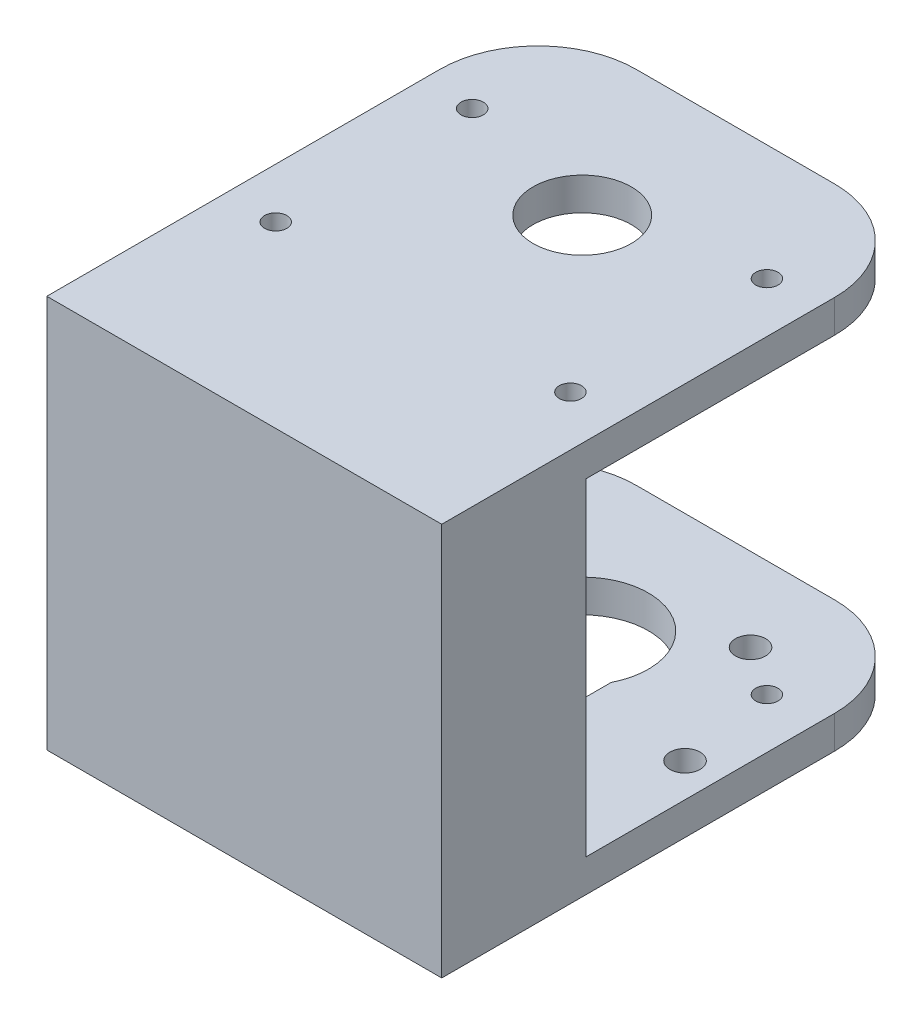
ISO-10303-21;
HEADER;
FILE_DESCRIPTION(('STEP AP214'),'2;1');
FILE_NAME('part.step','',(''),(''),'','','');
FILE_SCHEMA(('AUTOMOTIVE_DESIGN { 1 0 10303 214 1 1 1 1 }'));
ENDSEC;
DATA;
#1=APPLICATION_CONTEXT('core data for automotive mechanical design processes');
#2=APPLICATION_PROTOCOL_DEFINITION('international standard','automotive_design',2000,#1);
#3=PRODUCT_CONTEXT('',#1,'mechanical');
#4=PRODUCT('Part','Part','',(#3));
#5=PRODUCT_RELATED_PRODUCT_CATEGORY('part','',(#4));
#6=PRODUCT_DEFINITION_FORMATION('','',#4);
#7=PRODUCT_DEFINITION_CONTEXT('part definition',#1,'design');
#8=PRODUCT_DEFINITION('design','',#6,#7);
#9=PRODUCT_DEFINITION_SHAPE('','',#8);
#10=(LENGTH_UNIT() NAMED_UNIT(*) SI_UNIT(.MILLI.,.METRE.));
#11=(NAMED_UNIT(*) PLANE_ANGLE_UNIT() SI_UNIT($,.RADIAN.));
#12=(NAMED_UNIT(*) SI_UNIT($,.STERADIAN.) SOLID_ANGLE_UNIT());
#13=UNCERTAINTY_MEASURE_WITH_UNIT(LENGTH_MEASURE(1.E-05),#10,'distance_accuracy_value','');
#14=(GEOMETRIC_REPRESENTATION_CONTEXT(3) GLOBAL_UNCERTAINTY_ASSIGNED_CONTEXT((#13)) GLOBAL_UNIT_ASSIGNED_CONTEXT((#10,
#11,#12)) REPRESENTATION_CONTEXT('',''));
#15=CARTESIAN_POINT('',(0.,0.,0.));
#16=DIRECTION('',(0.,0.,1.));
#17=DIRECTION('',(1.,0.,0.));
#18=AXIS2_PLACEMENT_3D('',#15,#16,#17);
#19=CARTESIAN_POINT('',(15.15,5.,17.7));
#20=DIRECTION('',(0.,1.,0.));
#21=DIRECTION('',(0.,0.,1.));
#22=AXIS2_PLACEMENT_3D('',#19,#20,#21);
#23=PLANE('',#22);
#24=DIRECTION('',(-1.,0.,0.));
#25=VECTOR('',#24,1.);
#26=CARTESIAN_POINT('',(30.15,5.,20.3));
#27=LINE('',#26,#25);
#28=CARTESIAN_POINT('',(30.15,5.,20.3));
#29=VERTEX_POINT('',#28);
#30=CARTESIAN_POINT('',(17.2803508501983,5.,20.3));
#31=VERTEX_POINT('',#30);
#32=EDGE_CURVE('E51',#29,#31,#27,.T.);
#33=ORIENTED_EDGE('',*,*,#32,.F.);
#34=DIRECTION('',(0.,0.,-1.));
#35=VECTOR('',#34,1.);
#36=CARTESIAN_POINT('',(30.15,5.,17.7));
#37=LINE('',#36,#35);
#38=CARTESIAN_POINT('',(30.15,5.,-17.7));
#39=VERTEX_POINT('',#38);
#40=EDGE_CURVE('E184',#29,#39,#37,.T.);
#41=ORIENTED_EDGE('',*,*,#40,.T.);
#42=CARTESIAN_POINT('',(15.15,5.,-17.7));
#43=DIRECTION('',(0.,1.,0.));
#44=DIRECTION('',(0.,0.,1.));
#45=AXIS2_PLACEMENT_3D('',#42,#43,#44);
#46=CIRCLE('',#45,15.);
#47=CARTESIAN_POINT('',(15.15,5.,-32.7));
#48=VERTEX_POINT('',#47);
#49=EDGE_CURVE('E357',#39,#48,#46,.T.);
#50=ORIENTED_EDGE('',*,*,#49,.T.);
#51=DIRECTION('',(-1.,0.,0.));
#52=VECTOR('',#51,1.);
#53=CARTESIAN_POINT('',(15.15,5.,-32.7));
#54=LINE('',#53,#52);
#55=CARTESIAN_POINT('',(-15.15,5.,-32.7));
#56=VERTEX_POINT('',#55);
#57=EDGE_CURVE('E360',#48,#56,#54,.T.);
#58=ORIENTED_EDGE('',*,*,#57,.T.);
#59=CARTESIAN_POINT('',(-15.15,5.,-17.7));
#60=DIRECTION('',(0.,1.,0.));
#61=DIRECTION('',(0.,0.,1.));
#62=AXIS2_PLACEMENT_3D('',#59,#60,#61);
#63=CIRCLE('',#62,15.);
#64=CARTESIAN_POINT('',(-30.15,5.,-17.7));
#65=VERTEX_POINT('',#64);
#66=EDGE_CURVE('E362',#56,#65,#63,.T.);
#67=ORIENTED_EDGE('',*,*,#66,.T.);
#68=DIRECTION('',(0.,0.,1.));
#69=VECTOR('',#68,1.);
#70=CARTESIAN_POINT('',(-30.15,5.,17.7));
#71=LINE('',#70,#69);
#72=CARTESIAN_POINT('',(-30.15,5.,20.3));
#73=VERTEX_POINT('',#72);
#74=EDGE_CURVE('E58',#65,#73,#71,.T.);
#75=ORIENTED_EDGE('',*,*,#74,.T.);
#76=CARTESIAN_POINT('',(-17.2803508501983,5.,20.3));
#77=VERTEX_POINT('',#76);
#78=EDGE_CURVE('E185',#77,#73,#27,.T.);
#79=ORIENTED_EDGE('',*,*,#78,.F.);
#80=CARTESIAN_POINT('',(-15.,5.,20.));
#81=DIRECTION('',(0.,1.,0.));
#82=DIRECTION('',(0.,0.,1.));
#83=AXIS2_PLACEMENT_3D('',#80,#81,#82);
#84=CIRCLE('',#83,2.30000000000001);
#85=CARTESIAN_POINT('',(-12.7196491498017,5.,20.3));
#86=VERTEX_POINT('',#85);
#87=EDGE_CURVE('E338',#86,#77,#84,.T.);
#88=ORIENTED_EDGE('',*,*,#87,.F.);
#89=CARTESIAN_POINT('',(12.7196491498017,5.,20.3));
#90=VERTEX_POINT('',#89);
#91=EDGE_CURVE('E776',#90,#86,#27,.T.);
#92=ORIENTED_EDGE('',*,*,#91,.F.);
#93=CARTESIAN_POINT('',(15.,5.,20.));
#94=DIRECTION('',(0.,1.,0.));
#95=DIRECTION('',(0.,0.,-1.));
#96=AXIS2_PLACEMENT_3D('',#93,#94,#95);
#97=CIRCLE('',#96,2.30000000000001);
#98=EDGE_CURVE('E268',#31,#90,#97,.T.);
#99=ORIENTED_EDGE('',*,*,#98,.F.);
#100=EDGE_LOOP('',(#33,#41,#50,#58,#67,#75,#79,#88,#92,#99));
#101=FACE_BOUND('',#100,.T.);
#102=CARTESIAN_POINT('',(22.5,5.,15.));
#103=DIRECTION('',(0.,1.,0.));
#104=DIRECTION('',(0.,0.,-1.));
#105=AXIS2_PLACEMENT_3D('',#102,#103,#104);
#106=CIRCLE('',#105,1.70000000000001);
#107=CARTESIAN_POINT('',(22.5,5.,13.3));
#108=VERTEX_POINT('',#107);
#109=EDGE_CURVE('E271',#108,#108,#106,.T.);
#110=ORIENTED_EDGE('',*,*,#109,.F.);
#111=EDGE_LOOP('',(#110));
#112=FACE_BOUND('',#111,.T.);
#113=CARTESIAN_POINT('',(22.5,5.,-15.));
#114=DIRECTION('',(0.,1.,0.));
#115=DIRECTION('',(0.,0.,-1.));
#116=AXIS2_PLACEMENT_3D('',#113,#114,#115);
#117=CIRCLE('',#116,1.70000000000001);
#118=CARTESIAN_POINT('',(22.5,5.,-16.7));
#119=VERTEX_POINT('',#118);
#120=EDGE_CURVE('E283',#119,#119,#117,.T.);
#121=ORIENTED_EDGE('',*,*,#120,.F.);
#122=EDGE_LOOP('',(#121));
#123=FACE_BOUND('',#122,.T.);
#124=CARTESIAN_POINT('',(0.,5.,-9.29999999999999));
#125=DIRECTION('',(0.,1.,0.));
#126=DIRECTION('',(0.,0.,1.));
#127=AXIS2_PLACEMENT_3D('',#124,#125,#126);
#128=CIRCLE('',#127,10.1);
#129=CARTESIAN_POINT('',(8.99999999999999,5.,-4.71633334545364));
#130=VERTEX_POINT('',#129);
#131=CARTESIAN_POINT('',(-8.99999999999999,5.,-4.71633334545364));
#132=VERTEX_POINT('',#131);
#133=EDGE_CURVE('E297',#130,#132,#128,.T.);
#134=ORIENTED_EDGE('',*,*,#133,.F.);
#135=DIRECTION('',(0.,0.,-1.));
#136=VECTOR('',#135,1.);
#137=CARTESIAN_POINT('',(8.99999999999999,5.,-4.71633334545364));
#138=LINE('',#137,#136);
#139=CARTESIAN_POINT('',(9.00000000000001,5.,16.9));
#140=VERTEX_POINT('',#139);
#141=EDGE_CURVE('E295',#140,#130,#138,.T.);
#142=ORIENTED_EDGE('',*,*,#141,.F.);
#143=DIRECTION('',(1.,0.,0.));
#144=VECTOR('',#143,1.);
#145=CARTESIAN_POINT('',(-8.99999999999999,5.,16.9));
#146=LINE('',#145,#144);
#147=CARTESIAN_POINT('',(-8.99999999999999,5.,16.9));
#148=VERTEX_POINT('',#147);
#149=EDGE_CURVE('E303',#148,#140,#146,.T.);
#150=ORIENTED_EDGE('',*,*,#149,.F.);
#151=DIRECTION('',(0.,0.,1.));
#152=VECTOR('',#151,1.);
#153=CARTESIAN_POINT('',(-8.99999999999999,5.,-4.71633334545364));
#154=LINE('',#153,#152);
#155=EDGE_CURVE('E300',#132,#148,#154,.T.);
#156=ORIENTED_EDGE('',*,*,#155,.F.);
#157=EDGE_LOOP('',(#134,#142,#150,#156));
#158=FACE_BOUND('',#157,.T.);
#159=CARTESIAN_POINT('',(-22.5,5.,-15.));
#160=DIRECTION('',(0.,1.,0.));
#161=DIRECTION('',(0.,0.,1.));
#162=AXIS2_PLACEMENT_3D('',#159,#160,#161);
#163=CIRCLE('',#162,1.70000000000001);
#164=CARTESIAN_POINT('',(-22.5,5.,-13.3));
#165=VERTEX_POINT('',#164);
#166=EDGE_CURVE('E326',#165,#165,#163,.T.);
#167=ORIENTED_EDGE('',*,*,#166,.F.);
#168=EDGE_LOOP('',(#167));
#169=FACE_BOUND('',#168,.T.);
#170=CARTESIAN_POINT('',(-15.,5.,-20.));
#171=DIRECTION('',(0.,1.,0.));
#172=DIRECTION('',(0.,0.,1.));
#173=AXIS2_PLACEMENT_3D('',#170,#171,#172);
#174=CIRCLE('',#173,2.3);
#175=CARTESIAN_POINT('',(-15.,5.,-17.7));
#176=VERTEX_POINT('',#175);
#177=EDGE_CURVE('E350',#176,#176,#174,.T.);
#178=ORIENTED_EDGE('',*,*,#177,.F.);
#179=EDGE_LOOP('',(#178));
#180=FACE_BOUND('',#179,.T.);
#181=CARTESIAN_POINT('',(-25.,5.,0.));
#182=DIRECTION('',(0.,1.,0.));
#183=DIRECTION('',(0.,0.,1.));
#184=AXIS2_PLACEMENT_3D('',#181,#182,#183);
#185=CIRCLE('',#184,2.29999999999999);
#186=CARTESIAN_POINT('',(-25.,5.,2.29999999999999));
#187=VERTEX_POINT('',#186);
#188=EDGE_CURVE('E344',#187,#187,#185,.T.);
#189=ORIENTED_EDGE('',*,*,#188,.F.);
#190=EDGE_LOOP('',(#189));
#191=FACE_BOUND('',#190,.T.);
#192=CARTESIAN_POINT('',(-22.5,5.,15.));
#193=DIRECTION('',(0.,1.,0.));
#194=DIRECTION('',(0.,0.,1.));
#195=AXIS2_PLACEMENT_3D('',#192,#193,#194);
#196=CIRCLE('',#195,1.70000000000001);
#197=CARTESIAN_POINT('',(-22.5,5.,16.7));
#198=VERTEX_POINT('',#197);
#199=EDGE_CURVE('E332',#198,#198,#196,.T.);
#200=ORIENTED_EDGE('',*,*,#199,.F.);
#201=EDGE_LOOP('',(#200));
#202=FACE_BOUND('',#201,.T.);
#203=CARTESIAN_POINT('',(15.,5.,-20.));
#204=DIRECTION('',(0.,1.,0.));
#205=DIRECTION('',(0.,0.,-1.));
#206=AXIS2_PLACEMENT_3D('',#203,#204,#205);
#207=CIRCLE('',#206,2.3);
#208=CARTESIAN_POINT('',(15.,5.,-22.3));
#209=VERTEX_POINT('',#208);
#210=EDGE_CURVE('E289',#209,#209,#207,.T.);
#211=ORIENTED_EDGE('',*,*,#210,.F.);
#212=EDGE_LOOP('',(#211));
#213=FACE_BOUND('',#212,.T.);
#214=CARTESIAN_POINT('',(25.,5.,0.));
#215=DIRECTION('',(0.,1.,0.));
#216=DIRECTION('',(0.,0.,-1.));
#217=AXIS2_PLACEMENT_3D('',#214,#215,#216);
#218=CIRCLE('',#217,2.29999999999999);
#219=CARTESIAN_POINT('',(25.,5.,-2.29999999999999));
#220=VERTEX_POINT('',#219);
#221=EDGE_CURVE('E277',#220,#220,#218,.T.);
#222=ORIENTED_EDGE('',*,*,#221,.F.);
#223=EDGE_LOOP('',(#222));
#224=FACE_BOUND('',#223,.T.);
#225=ADVANCED_FACE('F36',(#101,#112,#123,#158,#169,#180,#191,#202,#213,#224),#23,.T.);
#226=CARTESIAN_POINT('',(15.15,0.,17.7));
#227=DIRECTION('',(0.,1.,0.));
#228=DIRECTION('',(0.,0.,1.));
#229=AXIS2_PLACEMENT_3D('',#226,#227,#228);
#230=PLANE('',#229);
#231=DIRECTION('',(-1.,0.,0.));
#232=VECTOR('',#231,1.);
#233=CARTESIAN_POINT('',(-30.15,0.,42.3));
#234=LINE('',#233,#232);
#235=CARTESIAN_POINT('',(30.15,0.,42.3));
#236=VERTEX_POINT('',#235);
#237=CARTESIAN_POINT('',(-30.15,0.,42.3));
#238=VERTEX_POINT('',#237);
#239=EDGE_CURVE('E254',#236,#238,#234,.T.);
#240=ORIENTED_EDGE('',*,*,#239,.T.);
#241=DIRECTION('',(0.,0.,1.));
#242=VECTOR('',#241,1.);
#243=CARTESIAN_POINT('',(-30.15,0.,17.7));
#244=LINE('',#243,#242);
#245=CARTESIAN_POINT('',(-30.15,0.,-17.7));
#246=VERTEX_POINT('',#245);
#247=EDGE_CURVE('E358',#246,#238,#244,.T.);
#248=ORIENTED_EDGE('',*,*,#247,.F.);
#249=CARTESIAN_POINT('',(-15.15,0.,-17.7));
#250=DIRECTION('',(0.,1.,0.));
#251=DIRECTION('',(0.,0.,1.));
#252=AXIS2_PLACEMENT_3D('',#249,#250,#251);
#253=CIRCLE('',#252,15.);
#254=CARTESIAN_POINT('',(-15.15,0.,-32.7));
#255=VERTEX_POINT('',#254);
#256=EDGE_CURVE('E371',#255,#246,#253,.T.);
#257=ORIENTED_EDGE('',*,*,#256,.F.);
#258=DIRECTION('',(-1.,0.,0.));
#259=VECTOR('',#258,1.);
#260=CARTESIAN_POINT('',(15.15,0.,-32.7));
#261=LINE('',#260,#259);
#262=CARTESIAN_POINT('',(15.15,0.,-32.7));
#263=VERTEX_POINT('',#262);
#264=EDGE_CURVE('E369',#263,#255,#261,.T.);
#265=ORIENTED_EDGE('',*,*,#264,.F.);
#266=CARTESIAN_POINT('',(15.15,0.,-17.7));
#267=DIRECTION('',(0.,1.,0.));
#268=DIRECTION('',(0.,0.,1.));
#269=AXIS2_PLACEMENT_3D('',#266,#267,#268);
#270=CIRCLE('',#269,15.);
#271=CARTESIAN_POINT('',(30.15,0.,-17.7));
#272=VERTEX_POINT('',#271);
#273=EDGE_CURVE('E367',#272,#263,#270,.T.);
#274=ORIENTED_EDGE('',*,*,#273,.F.);
#275=DIRECTION('',(0.,0.,-1.));
#276=VECTOR('',#275,1.);
#277=CARTESIAN_POINT('',(30.15,0.,17.7));
#278=LINE('',#277,#276);
#279=EDGE_CURVE('E353',#236,#272,#278,.T.);
#280=ORIENTED_EDGE('',*,*,#279,.F.);
#281=EDGE_LOOP('',(#240,#248,#257,#265,#274,#280));
#282=FACE_BOUND('',#281,.T.);
#283=CARTESIAN_POINT('',(-22.5,0.,-15.));
#284=DIRECTION('',(0.,1.,0.));
#285=DIRECTION('',(0.,0.,1.));
#286=AXIS2_PLACEMENT_3D('',#283,#284,#285);
#287=CIRCLE('',#286,1.70000000000001);
#288=CARTESIAN_POINT('',(-22.5,0.,-13.3));
#289=VERTEX_POINT('',#288);
#290=EDGE_CURVE('E325',#289,#289,#287,.T.);
#291=ORIENTED_EDGE('',*,*,#290,.T.);
#292=EDGE_LOOP('',(#291));
#293=FACE_BOUND('',#292,.T.);
#294=CARTESIAN_POINT('',(-22.5,0.,15.));
#295=DIRECTION('',(0.,1.,0.));
#296=DIRECTION('',(0.,0.,1.));
#297=AXIS2_PLACEMENT_3D('',#294,#295,#296);
#298=CIRCLE('',#297,1.70000000000001);
#299=CARTESIAN_POINT('',(-22.5,0.,16.7));
#300=VERTEX_POINT('',#299);
#301=EDGE_CURVE('E329',#300,#300,#298,.T.);
#302=ORIENTED_EDGE('',*,*,#301,.T.);
#303=EDGE_LOOP('',(#302));
#304=FACE_BOUND('',#303,.T.);
#305=CARTESIAN_POINT('',(-15.,0.,20.));
#306=DIRECTION('',(0.,1.,0.));
#307=DIRECTION('',(0.,0.,1.));
#308=AXIS2_PLACEMENT_3D('',#305,#306,#307);
#309=CIRCLE('',#308,2.30000000000001);
#310=CARTESIAN_POINT('',(-15.,0.,22.3));
#311=VERTEX_POINT('',#310);
#312=EDGE_CURVE('E335',#311,#311,#309,.T.);
#313=ORIENTED_EDGE('',*,*,#312,.T.);
#314=EDGE_LOOP('',(#313));
#315=FACE_BOUND('',#314,.T.);
#316=CARTESIAN_POINT('',(-25.,0.,0.));
#317=DIRECTION('',(0.,1.,0.));
#318=DIRECTION('',(0.,0.,1.));
#319=AXIS2_PLACEMENT_3D('',#316,#317,#318);
#320=CIRCLE('',#319,2.29999999999999);
#321=CARTESIAN_POINT('',(-25.,0.,2.29999999999999));
#322=VERTEX_POINT('',#321);
#323=EDGE_CURVE('E341',#322,#322,#320,.T.);
#324=ORIENTED_EDGE('',*,*,#323,.T.);
#325=EDGE_LOOP('',(#324));
#326=FACE_BOUND('',#325,.T.);
#327=CARTESIAN_POINT('',(-15.,0.,-20.));
#328=DIRECTION('',(0.,1.,0.));
#329=DIRECTION('',(0.,0.,1.));
#330=AXIS2_PLACEMENT_3D('',#327,#328,#329);
#331=CIRCLE('',#330,2.3);
#332=CARTESIAN_POINT('',(-15.,0.,-17.7));
#333=VERTEX_POINT('',#332);
#334=EDGE_CURVE('E347',#333,#333,#331,.T.);
#335=ORIENTED_EDGE('',*,*,#334,.T.);
#336=EDGE_LOOP('',(#335));
#337=FACE_BOUND('',#336,.T.);
#338=DIRECTION('',(0.,0.,-1.));
#339=VECTOR('',#338,1.);
#340=CARTESIAN_POINT('',(8.99999999999999,0.,-4.71633334545364));
#341=LINE('',#340,#339);
#342=CARTESIAN_POINT('',(9.00000000000001,0.,16.9));
#343=VERTEX_POINT('',#342);
#344=CARTESIAN_POINT('',(8.99999999999999,0.,-4.71633334545364));
#345=VERTEX_POINT('',#344);
#346=EDGE_CURVE('E292',#343,#345,#341,.T.);
#347=ORIENTED_EDGE('',*,*,#346,.T.);
#348=CARTESIAN_POINT('',(0.,0.,-9.29999999999999));
#349=DIRECTION('',(0.,1.,0.));
#350=DIRECTION('',(0.,0.,1.));
#351=AXIS2_PLACEMENT_3D('',#348,#349,#350);
#352=CIRCLE('',#351,10.1);
#353=CARTESIAN_POINT('',(-8.99999999999999,0.,-4.71633334545364));
#354=VERTEX_POINT('',#353);
#355=EDGE_CURVE('E308',#345,#354,#352,.T.);
#356=ORIENTED_EDGE('',*,*,#355,.T.);
#357=DIRECTION('',(0.,0.,1.));
#358=VECTOR('',#357,1.);
#359=CARTESIAN_POINT('',(-8.99999999999999,0.,-4.71633334545364));
#360=LINE('',#359,#358);
#361=CARTESIAN_POINT('',(-8.99999999999999,0.,16.9));
#362=VERTEX_POINT('',#361);
#363=EDGE_CURVE('E311',#354,#362,#360,.T.);
#364=ORIENTED_EDGE('',*,*,#363,.T.);
#365=DIRECTION('',(1.,0.,0.));
#366=VECTOR('',#365,1.);
#367=CARTESIAN_POINT('',(-8.99999999999999,0.,16.9));
#368=LINE('',#367,#366);
#369=EDGE_CURVE('E298',#362,#343,#368,.T.);
#370=ORIENTED_EDGE('',*,*,#369,.T.);
#371=EDGE_LOOP('',(#347,#356,#364,#370));
#372=FACE_BOUND('',#371,.T.);
#373=CARTESIAN_POINT('',(15.,0.,-20.));
#374=DIRECTION('',(0.,1.,0.));
#375=DIRECTION('',(0.,0.,-1.));
#376=AXIS2_PLACEMENT_3D('',#373,#374,#375);
#377=CIRCLE('',#376,2.3);
#378=CARTESIAN_POINT('',(15.,0.,-22.3));
#379=VERTEX_POINT('',#378);
#380=EDGE_CURVE('E286',#379,#379,#377,.T.);
#381=ORIENTED_EDGE('',*,*,#380,.T.);
#382=EDGE_LOOP('',(#381));
#383=FACE_BOUND('',#382,.T.);
#384=CARTESIAN_POINT('',(22.5,0.,-15.));
#385=DIRECTION('',(0.,1.,0.));
#386=DIRECTION('',(0.,0.,-1.));
#387=AXIS2_PLACEMENT_3D('',#384,#385,#386);
#388=CIRCLE('',#387,1.70000000000001);
#389=CARTESIAN_POINT('',(22.5,0.,-16.7));
#390=VERTEX_POINT('',#389);
#391=EDGE_CURVE('E280',#390,#390,#388,.T.);
#392=ORIENTED_EDGE('',*,*,#391,.T.);
#393=EDGE_LOOP('',(#392));
#394=FACE_BOUND('',#393,.T.);
#395=CARTESIAN_POINT('',(25.,0.,0.));
#396=DIRECTION('',(0.,1.,0.));
#397=DIRECTION('',(0.,0.,-1.));
#398=AXIS2_PLACEMENT_3D('',#395,#396,#397);
#399=CIRCLE('',#398,2.29999999999999);
#400=CARTESIAN_POINT('',(25.,0.,-2.29999999999999));
#401=VERTEX_POINT('',#400);
#402=EDGE_CURVE('E274',#401,#401,#399,.T.);
#403=ORIENTED_EDGE('',*,*,#402,.T.);
#404=EDGE_LOOP('',(#403));
#405=FACE_BOUND('',#404,.T.);
#406=CARTESIAN_POINT('',(22.5,0.,15.));
#407=DIRECTION('',(0.,1.,0.));
#408=DIRECTION('',(0.,0.,-1.));
#409=AXIS2_PLACEMENT_3D('',#406,#407,#408);
#410=CIRCLE('',#409,1.70000000000001);
#411=CARTESIAN_POINT('',(22.5,0.,13.3));
#412=VERTEX_POINT('',#411);
#413=EDGE_CURVE('E267',#412,#412,#410,.T.);
#414=ORIENTED_EDGE('',*,*,#413,.T.);
#415=EDGE_LOOP('',(#414));
#416=FACE_BOUND('',#415,.T.);
#417=CARTESIAN_POINT('',(15.,0.,20.));
#418=DIRECTION('',(0.,1.,0.));
#419=DIRECTION('',(0.,0.,-1.));
#420=AXIS2_PLACEMENT_3D('',#417,#418,#419);
#421=CIRCLE('',#420,2.30000000000001);
#422=CARTESIAN_POINT('',(15.,0.,17.7));
#423=VERTEX_POINT('',#422);
#424=EDGE_CURVE('E261',#423,#423,#421,.T.);
#425=ORIENTED_EDGE('',*,*,#424,.T.);
#426=EDGE_LOOP('',(#425));
#427=FACE_BOUND('',#426,.T.);
#428=ADVANCED_FACE('F390',(#282,#293,#304,#315,#326,#337,#372,#383,#394,#405,#416,#427),#230,.F.);
#429=CARTESIAN_POINT('',(30.15,5.,17.7));
#430=DIRECTION('',(-1.,0.,0.));
#431=DIRECTION('',(0.,0.,1.));
#432=AXIS2_PLACEMENT_3D('',#429,#430,#431);
#433=PLANE('',#432);
#434=ORIENTED_EDGE('',*,*,#40,.F.);
#435=DIRECTION('',(0.,-1.,0.));
#436=VECTOR('',#435,1.);
#437=CARTESIAN_POINT('',(30.15,55.,20.3));
#438=LINE('',#437,#436);
#439=CARTESIAN_POINT('',(30.15,55.,20.3));
#440=VERTEX_POINT('',#439);
#441=EDGE_CURVE('E178',#440,#29,#438,.T.);
#442=ORIENTED_EDGE('',*,*,#441,.F.);
#443=DIRECTION('',(0.,0.,-1.));
#444=VECTOR('',#443,1.);
#445=CARTESIAN_POINT('',(30.15,55.,42.3));
#446=LINE('',#445,#444);
#447=CARTESIAN_POINT('',(30.15,55.,-17.6999999999999));
#448=VERTEX_POINT('',#447);
#449=EDGE_CURVE('E159',#440,#448,#446,.T.);
#450=ORIENTED_EDGE('',*,*,#449,.T.);
#451=DIRECTION('',(0.,-1.,0.));
#452=VECTOR('',#451,1.);
#453=CARTESIAN_POINT('',(30.15,60.,-17.6999999999999));
#454=LINE('',#453,#452);
#455=CARTESIAN_POINT('',(30.15,60.,-17.6999999999999));
#456=VERTEX_POINT('',#455);
#457=EDGE_CURVE('E252',#456,#448,#454,.T.);
#458=ORIENTED_EDGE('',*,*,#457,.F.);
#459=DIRECTION('',(0.,0.,-1.));
#460=VECTOR('',#459,1.);
#461=CARTESIAN_POINT('',(30.15,60.,42.3));
#462=LINE('',#461,#460);
#463=CARTESIAN_POINT('',(30.15,60.,42.3));
#464=VERTEX_POINT('',#463);
#465=EDGE_CURVE('E230',#464,#456,#462,.T.);
#466=ORIENTED_EDGE('',*,*,#465,.F.);
#467=DIRECTION('',(0.,-1.,0.));
#468=VECTOR('',#467,1.);
#469=CARTESIAN_POINT('',(30.15,5.,42.3));
#470=LINE('',#469,#468);
#471=EDGE_CURVE('E257',#464,#236,#470,.T.);
#472=ORIENTED_EDGE('',*,*,#471,.T.);
#473=ORIENTED_EDGE('',*,*,#279,.T.);
#474=DIRECTION('',(0.,-1.,0.));
#475=VECTOR('',#474,1.);
#476=CARTESIAN_POINT('',(30.15,5.,-17.7));
#477=LINE('',#476,#475);
#478=EDGE_CURVE('E11',#39,#272,#477,.T.);
#479=ORIENTED_EDGE('',*,*,#478,.F.);
#480=EDGE_LOOP('',(#434,#442,#450,#458,#466,#472,#473,#479));
#481=FACE_BOUND('',#480,.T.);
#482=ADVANCED_FACE('F38',(#481),#433,.F.);
#483=CARTESIAN_POINT('',(15.15,5.,-17.7));
#484=DIRECTION('',(0.,-1.,0.));
#485=DIRECTION('',(0.,0.,-1.));
#486=AXIS2_PLACEMENT_3D('',#483,#484,#485);
#487=CYLINDRICAL_SURFACE('',#486,15.);
#488=ORIENTED_EDGE('',*,*,#273,.T.);
#489=DIRECTION('',(0.,-1.,0.));
#490=VECTOR('',#489,1.);
#491=CARTESIAN_POINT('',(15.15,5.,-32.7));
#492=LINE('',#491,#490);
#493=EDGE_CURVE('E44',#48,#263,#492,.T.);
#494=ORIENTED_EDGE('',*,*,#493,.F.);
#495=ORIENTED_EDGE('',*,*,#49,.F.);
#496=ORIENTED_EDGE('',*,*,#478,.T.);
#497=EDGE_LOOP('',(#488,#494,#495,#496));
#498=FACE_BOUND('',#497,.T.);
#499=ADVANCED_FACE('F421',(#498),#487,.T.);
#500=CARTESIAN_POINT('',(15.15,5.,-32.7));
#501=DIRECTION('',(0.,0.,1.));
#502=DIRECTION('',(1.,0.,0.));
#503=AXIS2_PLACEMENT_3D('',#500,#501,#502);
#504=PLANE('',#503);
#505=ORIENTED_EDGE('',*,*,#264,.T.);
#506=DIRECTION('',(0.,-1.,0.));
#507=VECTOR('',#506,1.);
#508=CARTESIAN_POINT('',(-15.15,5.,-32.7));
#509=LINE('',#508,#507);
#510=EDGE_CURVE('E376',#56,#255,#509,.T.);
#511=ORIENTED_EDGE('',*,*,#510,.F.);
#512=ORIENTED_EDGE('',*,*,#57,.F.);
#513=ORIENTED_EDGE('',*,*,#493,.T.);
#514=EDGE_LOOP('',(#505,#511,#512,#513));
#515=FACE_BOUND('',#514,.T.);
#516=ADVANCED_FACE('F383',(#515),#504,.F.);
#517=CARTESIAN_POINT('',(-15.15,5.,-17.7));
#518=DIRECTION('',(0.,-1.,0.));
#519=DIRECTION('',(0.,0.,-1.));
#520=AXIS2_PLACEMENT_3D('',#517,#518,#519);
#521=CYLINDRICAL_SURFACE('',#520,15.);
#522=ORIENTED_EDGE('',*,*,#256,.T.);
#523=DIRECTION('',(0.,-1.,0.));
#524=VECTOR('',#523,1.);
#525=CARTESIAN_POINT('',(-30.15,5.,-17.7));
#526=LINE('',#525,#524);
#527=EDGE_CURVE('E365',#65,#246,#526,.T.);
#528=ORIENTED_EDGE('',*,*,#527,.F.);
#529=ORIENTED_EDGE('',*,*,#66,.F.);
#530=ORIENTED_EDGE('',*,*,#510,.T.);
#531=EDGE_LOOP('',(#522,#528,#529,#530));
#532=FACE_BOUND('',#531,.T.);
#533=ADVANCED_FACE('F395',(#532),#521,.T.);
#534=CARTESIAN_POINT('',(-30.15,5.,17.7));
#535=DIRECTION('',(1.,0.,0.));
#536=DIRECTION('',(0.,0.,-1.));
#537=AXIS2_PLACEMENT_3D('',#534,#535,#536);
#538=PLANE('',#537);
#539=DIRECTION('',(0.,1.,0.));
#540=VECTOR('',#539,1.);
#541=CARTESIAN_POINT('',(-30.15,55.,20.3));
#542=LINE('',#541,#540);
#543=CARTESIAN_POINT('',(-30.15,55.,20.3));
#544=VERTEX_POINT('',#543);
#545=EDGE_CURVE('E180',#73,#544,#542,.T.);
#546=ORIENTED_EDGE('',*,*,#545,.F.);
#547=ORIENTED_EDGE('',*,*,#74,.F.);
#548=ORIENTED_EDGE('',*,*,#527,.T.);
#549=ORIENTED_EDGE('',*,*,#247,.T.);
#550=DIRECTION('',(0.,-1.,0.));
#551=VECTOR('',#550,1.);
#552=CARTESIAN_POINT('',(-30.15,5.,42.3));
#553=LINE('',#552,#551);
#554=CARTESIAN_POINT('',(-30.15,60.,42.3));
#555=VERTEX_POINT('',#554);
#556=EDGE_CURVE('E258',#555,#238,#553,.T.);
#557=ORIENTED_EDGE('',*,*,#556,.F.);
#558=DIRECTION('',(0.,0.,1.));
#559=VECTOR('',#558,1.);
#560=CARTESIAN_POINT('',(-30.15,60.,42.3));
#561=LINE('',#560,#559);
#562=CARTESIAN_POINT('',(-30.15,60.,-17.6999999999999));
#563=VERTEX_POINT('',#562);
#564=EDGE_CURVE('E223',#563,#555,#561,.T.);
#565=ORIENTED_EDGE('',*,*,#564,.F.);
#566=DIRECTION('',(0.,-1.,0.));
#567=VECTOR('',#566,1.);
#568=CARTESIAN_POINT('',(-30.15,60.,-17.6999999999999));
#569=LINE('',#568,#567);
#570=CARTESIAN_POINT('',(-30.15,55.,-17.6999999999999));
#571=VERTEX_POINT('',#570);
#572=EDGE_CURVE('E238',#563,#571,#569,.T.);
#573=ORIENTED_EDGE('',*,*,#572,.T.);
#574=DIRECTION('',(0.,0.,1.));
#575=VECTOR('',#574,1.);
#576=CARTESIAN_POINT('',(-30.15,55.,42.3));
#577=LINE('',#576,#575);
#578=EDGE_CURVE('E172',#571,#544,#577,.T.);
#579=ORIENTED_EDGE('',*,*,#578,.T.);
#580=EDGE_LOOP('',(#546,#547,#548,#549,#557,#565,#573,#579));
#581=FACE_BOUND('',#580,.T.);
#582=ADVANCED_FACE('F398',(#581),#538,.F.);
#583=CARTESIAN_POINT('',(-15.,5.,-20.));
#584=DIRECTION('',(0.,-1.,0.));
#585=DIRECTION('',(0.,0.,-1.));
#586=AXIS2_PLACEMENT_3D('',#583,#584,#585);
#587=CYLINDRICAL_SURFACE('',#586,2.3);
#588=ORIENTED_EDGE('',*,*,#177,.T.);
#589=EDGE_LOOP('',(#588));
#590=FACE_BOUND('',#589,.T.);
#591=ORIENTED_EDGE('',*,*,#334,.F.);
#592=EDGE_LOOP('',(#591));
#593=FACE_BOUND('',#592,.T.);
#594=ADVANCED_FACE('F511',(#590,#593),#587,.F.);
#595=CARTESIAN_POINT('',(-25.,5.,0.));
#596=DIRECTION('',(0.,-1.,0.));
#597=DIRECTION('',(0.,0.,-1.));
#598=AXIS2_PLACEMENT_3D('',#595,#596,#597);
#599=CYLINDRICAL_SURFACE('',#598,2.29999999999999);
#600=ORIENTED_EDGE('',*,*,#188,.T.);
#601=EDGE_LOOP('',(#600));
#602=FACE_BOUND('',#601,.T.);
#603=ORIENTED_EDGE('',*,*,#323,.F.);
#604=EDGE_LOOP('',(#603));
#605=FACE_BOUND('',#604,.T.);
#606=ADVANCED_FACE('F507',(#602,#605),#599,.F.);
#607=CARTESIAN_POINT('',(-15.,5.,20.));
#608=DIRECTION('',(0.,-1.,0.));
#609=DIRECTION('',(0.,0.,-1.));
#610=AXIS2_PLACEMENT_3D('',#607,#608,#609);
#611=CYLINDRICAL_SURFACE('',#610,2.30000000000001);
#612=ORIENTED_EDGE('',*,*,#87,.T.);
#613=CARTESIAN_POINT('',(-15.,5.,20.));
#614=DIRECTION('',(0.,1.,0.));
#615=DIRECTION('',(0.,0.,1.));
#616=AXIS2_PLACEMENT_3D('',#613,#614,#615);
#617=CIRCLE('',#616,2.30000000000001);
#618=EDGE_CURVE('E181',#77,#86,#617,.T.);
#619=ORIENTED_EDGE('',*,*,#618,.T.);
#620=EDGE_LOOP('',(#612,#619));
#621=FACE_BOUND('',#620,.T.);
#622=ORIENTED_EDGE('',*,*,#312,.F.);
#623=EDGE_LOOP('',(#622));
#624=FACE_BOUND('',#623,.T.);
#625=ADVANCED_FACE('F503',(#621,#624),#611,.F.);
#626=CARTESIAN_POINT('',(-22.5,5.,15.));
#627=DIRECTION('',(0.,-1.,0.));
#628=DIRECTION('',(0.,0.,-1.));
#629=AXIS2_PLACEMENT_3D('',#626,#627,#628);
#630=CYLINDRICAL_SURFACE('',#629,1.70000000000001);
#631=ORIENTED_EDGE('',*,*,#199,.T.);
#632=EDGE_LOOP('',(#631));
#633=FACE_BOUND('',#632,.T.);
#634=ORIENTED_EDGE('',*,*,#301,.F.);
#635=EDGE_LOOP('',(#634));
#636=FACE_BOUND('',#635,.T.);
#637=ADVANCED_FACE('F499',(#633,#636),#630,.F.);
#638=CARTESIAN_POINT('',(-22.5,5.,-15.));
#639=DIRECTION('',(0.,-1.,0.));
#640=DIRECTION('',(0.,0.,-1.));
#641=AXIS2_PLACEMENT_3D('',#638,#639,#640);
#642=CYLINDRICAL_SURFACE('',#641,1.70000000000001);
#643=ORIENTED_EDGE('',*,*,#166,.T.);
#644=EDGE_LOOP('',(#643));
#645=FACE_BOUND('',#644,.T.);
#646=ORIENTED_EDGE('',*,*,#290,.F.);
#647=EDGE_LOOP('',(#646));
#648=FACE_BOUND('',#647,.T.);
#649=ADVANCED_FACE('F495',(#645,#648),#642,.F.);
#650=CARTESIAN_POINT('',(8.99999999999999,5.,-4.71633334545364));
#651=DIRECTION('',(-1.,0.,0.));
#652=DIRECTION('',(0.,0.,1.));
#653=AXIS2_PLACEMENT_3D('',#650,#651,#652);
#654=PLANE('',#653);
#655=ORIENTED_EDGE('',*,*,#346,.F.);
#656=DIRECTION('',(0.,-1.,0.));
#657=VECTOR('',#656,1.);
#658=CARTESIAN_POINT('',(9.00000000000001,5.,16.9));
#659=LINE('',#658,#657);
#660=EDGE_CURVE('E305',#140,#343,#659,.T.);
#661=ORIENTED_EDGE('',*,*,#660,.F.);
#662=ORIENTED_EDGE('',*,*,#141,.T.);
#663=DIRECTION('',(0.,-1.,0.));
#664=VECTOR('',#663,1.);
#665=CARTESIAN_POINT('',(8.99999999999999,5.,-4.71633334545364));
#666=LINE('',#665,#664);
#667=EDGE_CURVE('E322',#130,#345,#666,.T.);
#668=ORIENTED_EDGE('',*,*,#667,.T.);
#669=EDGE_LOOP('',(#655,#661,#662,#668));
#670=FACE_BOUND('',#669,.T.);
#671=ADVANCED_FACE('F491',(#670),#654,.T.);
#672=CARTESIAN_POINT('',(0.,5.,-9.29999999999999));
#673=DIRECTION('',(0.,-1.,0.));
#674=DIRECTION('',(0.,0.,-1.));
#675=AXIS2_PLACEMENT_3D('',#672,#673,#674);
#676=CYLINDRICAL_SURFACE('',#675,10.1);
#677=ORIENTED_EDGE('',*,*,#355,.F.);
#678=ORIENTED_EDGE('',*,*,#667,.F.);
#679=ORIENTED_EDGE('',*,*,#133,.T.);
#680=DIRECTION('',(0.,-1.,0.));
#681=VECTOR('',#680,1.);
#682=CARTESIAN_POINT('',(-8.99999999999999,5.,-4.71633334545364));
#683=LINE('',#682,#681);
#684=EDGE_CURVE('E320',#132,#354,#683,.T.);
#685=ORIENTED_EDGE('',*,*,#684,.T.);
#686=EDGE_LOOP('',(#677,#678,#679,#685));
#687=FACE_BOUND('',#686,.T.);
#688=ADVANCED_FACE('F487',(#687),#676,.F.);
#689=CARTESIAN_POINT('',(-8.99999999999999,5.,-4.71633334545364));
#690=DIRECTION('',(1.,0.,0.));
#691=DIRECTION('',(0.,0.,-1.));
#692=AXIS2_PLACEMENT_3D('',#689,#690,#691);
#693=PLANE('',#692);
#694=ORIENTED_EDGE('',*,*,#363,.F.);
#695=ORIENTED_EDGE('',*,*,#684,.F.);
#696=ORIENTED_EDGE('',*,*,#155,.T.);
#697=DIRECTION('',(0.,-1.,0.));
#698=VECTOR('',#697,1.);
#699=CARTESIAN_POINT('',(-8.99999999999999,5.,16.9));
#700=LINE('',#699,#698);
#701=EDGE_CURVE('E318',#148,#362,#700,.T.);
#702=ORIENTED_EDGE('',*,*,#701,.T.);
#703=EDGE_LOOP('',(#694,#695,#696,#702));
#704=FACE_BOUND('',#703,.T.);
#705=ADVANCED_FACE('F483',(#704),#693,.T.);
#706=CARTESIAN_POINT('',(-8.99999999999999,5.,16.9));
#707=DIRECTION('',(0.,0.,-1.));
#708=DIRECTION('',(-1.,0.,0.));
#709=AXIS2_PLACEMENT_3D('',#706,#707,#708);
#710=PLANE('',#709);
#711=ORIENTED_EDGE('',*,*,#369,.F.);
#712=ORIENTED_EDGE('',*,*,#701,.F.);
#713=ORIENTED_EDGE('',*,*,#149,.T.);
#714=ORIENTED_EDGE('',*,*,#660,.T.);
#715=EDGE_LOOP('',(#711,#712,#713,#714));
#716=FACE_BOUND('',#715,.T.);
#717=ADVANCED_FACE('F479',(#716),#710,.T.);
#718=CARTESIAN_POINT('',(15.,5.,-20.));
#719=DIRECTION('',(0.,-1.,0.));
#720=DIRECTION('',(0.,0.,-1.));
#721=AXIS2_PLACEMENT_3D('',#718,#719,#720);
#722=CYLINDRICAL_SURFACE('',#721,2.3);
#723=ORIENTED_EDGE('',*,*,#210,.T.);
#724=EDGE_LOOP('',(#723));
#725=FACE_BOUND('',#724,.T.);
#726=ORIENTED_EDGE('',*,*,#380,.F.);
#727=EDGE_LOOP('',(#726));
#728=FACE_BOUND('',#727,.T.);
#729=ADVANCED_FACE('F475',(#725,#728),#722,.F.);
#730=CARTESIAN_POINT('',(22.5,5.,-15.));
#731=DIRECTION('',(0.,-1.,0.));
#732=DIRECTION('',(0.,0.,-1.));
#733=AXIS2_PLACEMENT_3D('',#730,#731,#732);
#734=CYLINDRICAL_SURFACE('',#733,1.70000000000001);
#735=ORIENTED_EDGE('',*,*,#120,.T.);
#736=EDGE_LOOP('',(#735));
#737=FACE_BOUND('',#736,.T.);
#738=ORIENTED_EDGE('',*,*,#391,.F.);
#739=EDGE_LOOP('',(#738));
#740=FACE_BOUND('',#739,.T.);
#741=ADVANCED_FACE('F449',(#737,#740),#734,.F.);
#742=CARTESIAN_POINT('',(25.,5.,0.));
#743=DIRECTION('',(0.,-1.,0.));
#744=DIRECTION('',(0.,0.,-1.));
#745=AXIS2_PLACEMENT_3D('',#742,#743,#744);
#746=CYLINDRICAL_SURFACE('',#745,2.29999999999999);
#747=ORIENTED_EDGE('',*,*,#221,.T.);
#748=EDGE_LOOP('',(#747));
#749=FACE_BOUND('',#748,.T.);
#750=ORIENTED_EDGE('',*,*,#402,.F.);
#751=EDGE_LOOP('',(#750));
#752=FACE_BOUND('',#751,.T.);
#753=ADVANCED_FACE('F445',(#749,#752),#746,.F.);
#754=CARTESIAN_POINT('',(22.5,5.,15.));
#755=DIRECTION('',(0.,-1.,0.));
#756=DIRECTION('',(0.,0.,-1.));
#757=AXIS2_PLACEMENT_3D('',#754,#755,#756);
#758=CYLINDRICAL_SURFACE('',#757,1.70000000000001);
#759=ORIENTED_EDGE('',*,*,#109,.T.);
#760=EDGE_LOOP('',(#759));
#761=FACE_BOUND('',#760,.T.);
#762=ORIENTED_EDGE('',*,*,#413,.F.);
#763=EDGE_LOOP('',(#762));
#764=FACE_BOUND('',#763,.T.);
#765=ADVANCED_FACE('F448',(#761,#764),#758,.F.);
#766=CARTESIAN_POINT('',(15.,5.,20.));
#767=DIRECTION('',(0.,-1.,0.));
#768=DIRECTION('',(0.,0.,-1.));
#769=AXIS2_PLACEMENT_3D('',#766,#767,#768);
#770=CYLINDRICAL_SURFACE('',#769,2.30000000000001);
#771=EDGE_CURVE('E264',#90,#31,#97,.T.);
#772=ORIENTED_EDGE('',*,*,#771,.T.);
#773=ORIENTED_EDGE('',*,*,#98,.T.);
#774=EDGE_LOOP('',(#772,#773));
#775=FACE_BOUND('',#774,.T.);
#776=ORIENTED_EDGE('',*,*,#424,.F.);
#777=EDGE_LOOP('',(#776));
#778=FACE_BOUND('',#777,.T.);
#779=ADVANCED_FACE('F460',(#775,#778),#770,.F.);
#780=CARTESIAN_POINT('',(-30.15,5.,42.3));
#781=DIRECTION('',(0.,0.,1.));
#782=DIRECTION('',(1.,0.,0.));
#783=AXIS2_PLACEMENT_3D('',#780,#781,#782);
#784=PLANE('',#783);
#785=ORIENTED_EDGE('',*,*,#239,.F.);
#786=ORIENTED_EDGE('',*,*,#471,.F.);
#787=DIRECTION('',(1.,0.,0.));
#788=VECTOR('',#787,1.);
#789=CARTESIAN_POINT('',(-30.15,60.,42.3));
#790=LINE('',#789,#788);
#791=EDGE_CURVE('E226',#555,#464,#790,.T.);
#792=ORIENTED_EDGE('',*,*,#791,.F.);
#793=ORIENTED_EDGE('',*,*,#556,.T.);
#794=EDGE_LOOP('',(#785,#786,#792,#793));
#795=FACE_BOUND('',#794,.T.);
#796=ADVANCED_FACE('F420',(#795),#784,.T.);
#797=CARTESIAN_POINT('',(-15.15,60.,-17.7));
#798=DIRECTION('',(0.,-1.,0.));
#799=DIRECTION('',(0.,0.,-1.));
#800=AXIS2_PLACEMENT_3D('',#797,#798,#799);
#801=PLANE('',#800);
#802=ORIENTED_EDGE('',*,*,#564,.T.);
#803=ORIENTED_EDGE('',*,*,#791,.T.);
#804=ORIENTED_EDGE('',*,*,#465,.T.);
#805=CARTESIAN_POINT('',(15.15,60.,-17.7));
#806=DIRECTION('',(0.,1.,0.));
#807=DIRECTION('',(0.,0.,-1.));
#808=AXIS2_PLACEMENT_3D('',#805,#806,#807);
#809=CIRCLE('',#808,15.);
#810=CARTESIAN_POINT('',(15.1499999999999,60.,-32.7));
#811=VERTEX_POINT('',#810);
#812=EDGE_CURVE('E232',#456,#811,#809,.T.);
#813=ORIENTED_EDGE('',*,*,#812,.T.);
#814=DIRECTION('',(-1.,0.,0.));
#815=VECTOR('',#814,1.);
#816=CARTESIAN_POINT('',(-15.1499999999999,60.,-32.7));
#817=LINE('',#816,#815);
#818=CARTESIAN_POINT('',(-15.1499999999999,60.,-32.7));
#819=VERTEX_POINT('',#818);
#820=EDGE_CURVE('E234',#811,#819,#817,.T.);
#821=ORIENTED_EDGE('',*,*,#820,.T.);
#822=CARTESIAN_POINT('',(-15.15,60.,-17.7));
#823=DIRECTION('',(0.,1.,0.));
#824=DIRECTION('',(0.,0.,-1.));
#825=AXIS2_PLACEMENT_3D('',#822,#823,#824);
#826=CIRCLE('',#825,15.);
#827=EDGE_CURVE('E236',#819,#563,#826,.T.);
#828=ORIENTED_EDGE('',*,*,#827,.T.);
#829=EDGE_LOOP('',(#802,#803,#804,#813,#821,#828));
#830=FACE_BOUND('',#829,.T.);
#831=CARTESIAN_POINT('',(-22.5,60.,-15.));
#832=DIRECTION('',(0.,1.,0.));
#833=DIRECTION('',(0.,0.,1.));
#834=AXIS2_PLACEMENT_3D('',#831,#832,#833);
#835=CIRCLE('',#834,1.70000000000001);
#836=CARTESIAN_POINT('',(-22.5,60.,-13.3));
#837=VERTEX_POINT('',#836);
#838=EDGE_CURVE('E218',#837,#837,#835,.T.);
#839=ORIENTED_EDGE('',*,*,#838,.F.);
#840=EDGE_LOOP('',(#839));
#841=FACE_BOUND('',#840,.T.);
#842=CARTESIAN_POINT('',(-22.5,60.,15.));
#843=DIRECTION('',(0.,1.,0.));
#844=DIRECTION('',(0.,0.,1.));
#845=AXIS2_PLACEMENT_3D('',#842,#843,#844);
#846=CIRCLE('',#845,1.70000000000001);
#847=CARTESIAN_POINT('',(-22.5,60.,16.7));
#848=VERTEX_POINT('',#847);
#849=EDGE_CURVE('E212',#848,#848,#846,.T.);
#850=ORIENTED_EDGE('',*,*,#849,.F.);
#851=EDGE_LOOP('',(#850));
#852=FACE_BOUND('',#851,.T.);
#853=CARTESIAN_POINT('',(22.5,60.,-15.));
#854=DIRECTION('',(0.,1.,0.));
#855=DIRECTION('',(0.,0.,1.));
#856=AXIS2_PLACEMENT_3D('',#853,#854,#855);
#857=CIRCLE('',#856,1.70000000000001);
#858=CARTESIAN_POINT('',(22.5,60.,-13.3));
#859=VERTEX_POINT('',#858);
#860=EDGE_CURVE('E206',#859,#859,#857,.T.);
#861=ORIENTED_EDGE('',*,*,#860,.F.);
#862=EDGE_LOOP('',(#861));
#863=FACE_BOUND('',#862,.T.);
#864=CARTESIAN_POINT('',(22.5,60.,15.));
#865=DIRECTION('',(0.,1.,0.));
#866=DIRECTION('',(0.,0.,1.));
#867=AXIS2_PLACEMENT_3D('',#864,#865,#866);
#868=CIRCLE('',#867,1.70000000000001);
#869=CARTESIAN_POINT('',(22.5,60.,16.7));
#870=VERTEX_POINT('',#869);
#871=EDGE_CURVE('E200',#870,#870,#868,.T.);
#872=ORIENTED_EDGE('',*,*,#871,.F.);
#873=EDGE_LOOP('',(#872));
#874=FACE_BOUND('',#873,.T.);
#875=CARTESIAN_POINT('',(0.,60.,-9.29999999999999));
#876=DIRECTION('',(0.,1.,0.));
#877=DIRECTION('',(0.,0.,1.));
#878=AXIS2_PLACEMENT_3D('',#875,#876,#877);
#879=CIRCLE('',#878,7.5);
#880=CARTESIAN_POINT('',(0.,60.,-1.79999999999999));
#881=VERTEX_POINT('',#880);
#882=EDGE_CURVE('E194',#881,#881,#879,.T.);
#883=ORIENTED_EDGE('',*,*,#882,.F.);
#884=EDGE_LOOP('',(#883));
#885=FACE_BOUND('',#884,.T.);
#886=ADVANCED_FACE('F416',(#830,#841,#852,#863,#874,#885),#801,.F.);
#887=CARTESIAN_POINT('',(-15.15,55.,-17.7));
#888=DIRECTION('',(0.,-1.,0.));
#889=DIRECTION('',(0.,0.,-1.));
#890=AXIS2_PLACEMENT_3D('',#887,#888,#889);
#891=PLANE('',#890);
#892=DIRECTION('',(1.,0.,0.));
#893=VECTOR('',#892,1.);
#894=CARTESIAN_POINT('',(30.15,55.,20.3));
#895=LINE('',#894,#893);
#896=EDGE_CURVE('E164',#544,#440,#895,.T.);
#897=ORIENTED_EDGE('',*,*,#896,.F.);
#898=ORIENTED_EDGE('',*,*,#578,.F.);
#899=CARTESIAN_POINT('',(-15.15,55.,-17.7));
#900=DIRECTION('',(0.,1.,0.));
#901=DIRECTION('',(0.,0.,-1.));
#902=AXIS2_PLACEMENT_3D('',#899,#900,#901);
#903=CIRCLE('',#902,15.);
#904=CARTESIAN_POINT('',(-15.1499999999999,55.,-32.7));
#905=VERTEX_POINT('',#904);
#906=EDGE_CURVE('E227',#905,#571,#903,.T.);
#907=ORIENTED_EDGE('',*,*,#906,.F.);
#908=DIRECTION('',(-1.,0.,0.));
#909=VECTOR('',#908,1.);
#910=CARTESIAN_POINT('',(-15.1499999999999,55.,-32.7));
#911=LINE('',#910,#909);
#912=CARTESIAN_POINT('',(15.1499999999999,55.,-32.7));
#913=VERTEX_POINT('',#912);
#914=EDGE_CURVE('E241',#913,#905,#911,.T.);
#915=ORIENTED_EDGE('',*,*,#914,.F.);
#916=CARTESIAN_POINT('',(15.15,55.,-17.7));
#917=DIRECTION('',(0.,1.,0.));
#918=DIRECTION('',(0.,0.,-1.));
#919=AXIS2_PLACEMENT_3D('',#916,#917,#918);
#920=CIRCLE('',#919,15.);
#921=EDGE_CURVE('E167',#448,#913,#920,.T.);
#922=ORIENTED_EDGE('',*,*,#921,.F.);
#923=ORIENTED_EDGE('',*,*,#449,.F.);
#924=EDGE_LOOP('',(#897,#898,#907,#915,#922,#923));
#925=FACE_BOUND('',#924,.T.);
#926=CARTESIAN_POINT('',(22.5,55.,15.));
#927=DIRECTION('',(0.,1.,0.));
#928=DIRECTION('',(0.,0.,1.));
#929=AXIS2_PLACEMENT_3D('',#926,#927,#928);
#930=CIRCLE('',#929,1.70000000000001);
#931=CARTESIAN_POINT('',(22.5,55.,16.7));
#932=VERTEX_POINT('',#931);
#933=EDGE_CURVE('E197',#932,#932,#930,.T.);
#934=ORIENTED_EDGE('',*,*,#933,.T.);
#935=EDGE_LOOP('',(#934));
#936=FACE_BOUND('',#935,.T.);
#937=CARTESIAN_POINT('',(-22.5,55.,15.));
#938=DIRECTION('',(0.,1.,0.));
#939=DIRECTION('',(0.,0.,1.));
#940=AXIS2_PLACEMENT_3D('',#937,#938,#939);
#941=CIRCLE('',#940,1.70000000000001);
#942=CARTESIAN_POINT('',(-22.5,55.,16.7));
#943=VERTEX_POINT('',#942);
#944=EDGE_CURVE('E209',#943,#943,#941,.T.);
#945=ORIENTED_EDGE('',*,*,#944,.T.);
#946=EDGE_LOOP('',(#945));
#947=FACE_BOUND('',#946,.T.);
#948=CARTESIAN_POINT('',(-22.5,55.,-15.));
#949=DIRECTION('',(0.,1.,0.));
#950=DIRECTION('',(0.,0.,1.));
#951=AXIS2_PLACEMENT_3D('',#948,#949,#950);
#952=CIRCLE('',#951,1.70000000000001);
#953=CARTESIAN_POINT('',(-22.5,55.,-13.3));
#954=VERTEX_POINT('',#953);
#955=EDGE_CURVE('E215',#954,#954,#952,.T.);
#956=ORIENTED_EDGE('',*,*,#955,.T.);
#957=EDGE_LOOP('',(#956));
#958=FACE_BOUND('',#957,.T.);
#959=CARTESIAN_POINT('',(22.5,55.,-15.));
#960=DIRECTION('',(0.,1.,0.));
#961=DIRECTION('',(0.,0.,1.));
#962=AXIS2_PLACEMENT_3D('',#959,#960,#961);
#963=CIRCLE('',#962,1.70000000000001);
#964=CARTESIAN_POINT('',(22.5,55.,-13.3));
#965=VERTEX_POINT('',#964);
#966=EDGE_CURVE('E203',#965,#965,#963,.T.);
#967=ORIENTED_EDGE('',*,*,#966,.T.);
#968=EDGE_LOOP('',(#967));
#969=FACE_BOUND('',#968,.T.);
#970=CARTESIAN_POINT('',(0.,55.,-9.29999999999999));
#971=DIRECTION('',(0.,1.,0.));
#972=DIRECTION('',(0.,0.,1.));
#973=AXIS2_PLACEMENT_3D('',#970,#971,#972);
#974=CIRCLE('',#973,7.5);
#975=CARTESIAN_POINT('',(0.,55.,-1.79999999999999));
#976=VERTEX_POINT('',#975);
#977=EDGE_CURVE('E193',#976,#976,#974,.T.);
#978=ORIENTED_EDGE('',*,*,#977,.T.);
#979=EDGE_LOOP('',(#978));
#980=FACE_BOUND('',#979,.T.);
#981=ADVANCED_FACE('F161',(#925,#936,#947,#958,#969,#980),#891,.T.);
#982=CARTESIAN_POINT('',(15.15,60.,-17.7));
#983=DIRECTION('',(0.,-1.,0.));
#984=DIRECTION('',(0.,0.,-1.));
#985=AXIS2_PLACEMENT_3D('',#982,#983,#984);
#986=CYLINDRICAL_SURFACE('',#985,15.);
#987=ORIENTED_EDGE('',*,*,#921,.T.);
#988=DIRECTION('',(0.,-1.,0.));
#989=VECTOR('',#988,1.);
#990=CARTESIAN_POINT('',(15.1499999999999,60.,-32.7));
#991=LINE('',#990,#989);
#992=EDGE_CURVE('E249',#811,#913,#991,.T.);
#993=ORIENTED_EDGE('',*,*,#992,.F.);
#994=ORIENTED_EDGE('',*,*,#812,.F.);
#995=ORIENTED_EDGE('',*,*,#457,.T.);
#996=EDGE_LOOP('',(#987,#993,#994,#995));
#997=FACE_BOUND('',#996,.T.);
#998=ADVANCED_FACE('F412',(#997),#986,.T.);
#999=CARTESIAN_POINT('',(-15.1499999999999,60.,-32.7));
#1000=DIRECTION('',(0.,0.,1.));
#1001=DIRECTION('',(1.,0.,0.));
#1002=AXIS2_PLACEMENT_3D('',#999,#1000,#1001);
#1003=PLANE('',#1002);
#1004=ORIENTED_EDGE('',*,*,#914,.T.);
#1005=DIRECTION('',(0.,-1.,0.));
#1006=VECTOR('',#1005,1.);
#1007=CARTESIAN_POINT('',(-15.1499999999999,60.,-32.7));
#1008=LINE('',#1007,#1006);
#1009=EDGE_CURVE('E246',#819,#905,#1008,.T.);
#1010=ORIENTED_EDGE('',*,*,#1009,.F.);
#1011=ORIENTED_EDGE('',*,*,#820,.F.);
#1012=ORIENTED_EDGE('',*,*,#992,.T.);
#1013=EDGE_LOOP('',(#1004,#1010,#1011,#1012));
#1014=FACE_BOUND('',#1013,.T.);
#1015=ADVANCED_FACE('F408',(#1014),#1003,.F.);
#1016=CARTESIAN_POINT('',(-15.15,60.,-17.7));
#1017=DIRECTION('',(0.,-1.,0.));
#1018=DIRECTION('',(0.,0.,-1.));
#1019=AXIS2_PLACEMENT_3D('',#1016,#1017,#1018);
#1020=CYLINDRICAL_SURFACE('',#1019,15.);
#1021=ORIENTED_EDGE('',*,*,#906,.T.);
#1022=ORIENTED_EDGE('',*,*,#572,.F.);
#1023=ORIENTED_EDGE('',*,*,#827,.F.);
#1024=ORIENTED_EDGE('',*,*,#1009,.T.);
#1025=EDGE_LOOP('',(#1021,#1022,#1023,#1024));
#1026=FACE_BOUND('',#1025,.T.);
#1027=ADVANCED_FACE('F403',(#1026),#1020,.T.);
#1028=CARTESIAN_POINT('',(-22.5,60.,-15.));
#1029=DIRECTION('',(0.,-1.,0.));
#1030=DIRECTION('',(0.,0.,-1.));
#1031=AXIS2_PLACEMENT_3D('',#1028,#1029,#1030);
#1032=CYLINDRICAL_SURFACE('',#1031,1.70000000000001);
#1033=ORIENTED_EDGE('',*,*,#838,.T.);
#1034=EDGE_LOOP('',(#1033));
#1035=FACE_BOUND('',#1034,.T.);
#1036=ORIENTED_EDGE('',*,*,#955,.F.);
#1037=EDGE_LOOP('',(#1036));
#1038=FACE_BOUND('',#1037,.T.);
#1039=ADVANCED_FACE('F582',(#1035,#1038),#1032,.F.);
#1040=CARTESIAN_POINT('',(-22.5,60.,15.));
#1041=DIRECTION('',(0.,-1.,0.));
#1042=DIRECTION('',(0.,0.,-1.));
#1043=AXIS2_PLACEMENT_3D('',#1040,#1041,#1042);
#1044=CYLINDRICAL_SURFACE('',#1043,1.70000000000001);
#1045=ORIENTED_EDGE('',*,*,#849,.T.);
#1046=EDGE_LOOP('',(#1045));
#1047=FACE_BOUND('',#1046,.T.);
#1048=ORIENTED_EDGE('',*,*,#944,.F.);
#1049=EDGE_LOOP('',(#1048));
#1050=FACE_BOUND('',#1049,.T.);
#1051=ADVANCED_FACE('F572',(#1047,#1050),#1044,.F.);
#1052=CARTESIAN_POINT('',(22.5,60.,-15.));
#1053=DIRECTION('',(0.,-1.,0.));
#1054=DIRECTION('',(0.,0.,-1.));
#1055=AXIS2_PLACEMENT_3D('',#1052,#1053,#1054);
#1056=CYLINDRICAL_SURFACE('',#1055,1.70000000000001);
#1057=ORIENTED_EDGE('',*,*,#860,.T.);
#1058=EDGE_LOOP('',(#1057));
#1059=FACE_BOUND('',#1058,.T.);
#1060=ORIENTED_EDGE('',*,*,#966,.F.);
#1061=EDGE_LOOP('',(#1060));
#1062=FACE_BOUND('',#1061,.T.);
#1063=ADVANCED_FACE('F562',(#1059,#1062),#1056,.F.);
#1064=CARTESIAN_POINT('',(22.5,60.,15.));
#1065=DIRECTION('',(0.,-1.,0.));
#1066=DIRECTION('',(0.,0.,-1.));
#1067=AXIS2_PLACEMENT_3D('',#1064,#1065,#1066);
#1068=CYLINDRICAL_SURFACE('',#1067,1.70000000000001);
#1069=ORIENTED_EDGE('',*,*,#871,.T.);
#1070=EDGE_LOOP('',(#1069));
#1071=FACE_BOUND('',#1070,.T.);
#1072=ORIENTED_EDGE('',*,*,#933,.F.);
#1073=EDGE_LOOP('',(#1072));
#1074=FACE_BOUND('',#1073,.T.);
#1075=ADVANCED_FACE('F551',(#1071,#1074),#1068,.F.);
#1076=CARTESIAN_POINT('',(0.,60.,-9.29999999999999));
#1077=DIRECTION('',(0.,-1.,0.));
#1078=DIRECTION('',(0.,0.,-1.));
#1079=AXIS2_PLACEMENT_3D('',#1076,#1077,#1078);
#1080=CYLINDRICAL_SURFACE('',#1079,7.5);
#1081=ORIENTED_EDGE('',*,*,#882,.T.);
#1082=EDGE_LOOP('',(#1081));
#1083=FACE_BOUND('',#1082,.T.);
#1084=ORIENTED_EDGE('',*,*,#977,.F.);
#1085=EDGE_LOOP('',(#1084));
#1086=FACE_BOUND('',#1085,.T.);
#1087=ADVANCED_FACE('F545',(#1083,#1086),#1080,.F.);
#1088=CARTESIAN_POINT('',(30.15,5.,20.3));
#1089=DIRECTION('',(0.,1.,0.));
#1090=DIRECTION('',(0.,0.,1.));
#1091=AXIS2_PLACEMENT_3D('',#1088,#1089,#1090);
#1092=PLANE('',#1091);
#1093=ORIENTED_EDGE('',*,*,#618,.F.);
#1094=EDGE_CURVE('E187',#86,#77,#27,.T.);
#1095=ORIENTED_EDGE('',*,*,#1094,.F.);
#1096=EDGE_LOOP('',(#1093,#1095));
#1097=FACE_BOUND('',#1096,.T.);
#1098=ADVANCED_FACE('F550',(#1097),#1092,.F.);
#1099=ORIENTED_EDGE('',*,*,#771,.F.);
#1100=EDGE_CURVE('E190',#31,#90,#27,.T.);
#1101=ORIENTED_EDGE('',*,*,#1100,.F.);
#1102=EDGE_LOOP('',(#1099,#1101));
#1103=FACE_BOUND('',#1102,.T.);
#1104=ADVANCED_FACE('F749',(#1103),#1092,.F.);
#1105=CARTESIAN_POINT('',(0.,0.,20.3));
#1106=DIRECTION('',(0.,0.,-1.));
#1107=DIRECTION('',(-1.,0.,0.));
#1108=AXIS2_PLACEMENT_3D('',#1105,#1106,#1107);
#1109=PLANE('',#1108);
#1110=ORIENTED_EDGE('',*,*,#441,.T.);
#1111=ORIENTED_EDGE('',*,*,#32,.T.);
#1112=ORIENTED_EDGE('',*,*,#1100,.T.);
#1113=ORIENTED_EDGE('',*,*,#91,.T.);
#1114=ORIENTED_EDGE('',*,*,#1094,.T.);
#1115=ORIENTED_EDGE('',*,*,#78,.T.);
#1116=ORIENTED_EDGE('',*,*,#545,.T.);
#1117=ORIENTED_EDGE('',*,*,#896,.T.);
#1118=EDGE_LOOP('',(#1110,#1111,#1112,#1113,#1114,#1115,#1116,#1117));
#1119=FACE_BOUND('',#1118,.T.);
#1120=ADVANCED_FACE('F177',(#1119),#1109,.T.);
#1121=CLOSED_SHELL('',(#225,#428,#482,#499,#516,#533,#582,#594,#606,#625,#637,#649,#671,#688,
#705,#717,#729,#741,#753,#765,#779,#796,#886,#981,#998,#1015,#1027,#1039,#1051,#1063,#1075,
#1087,#1098,#1104,#1120));
#1122=MANIFOLD_SOLID_BREP('B2',#1121);
#1123=ADVANCED_BREP_SHAPE_REPRESENTATION('',(#18,#1122),#14);
#1124=SHAPE_DEFINITION_REPRESENTATION(#9,#1123);
ENDSEC;
END-ISO-10303-21;
